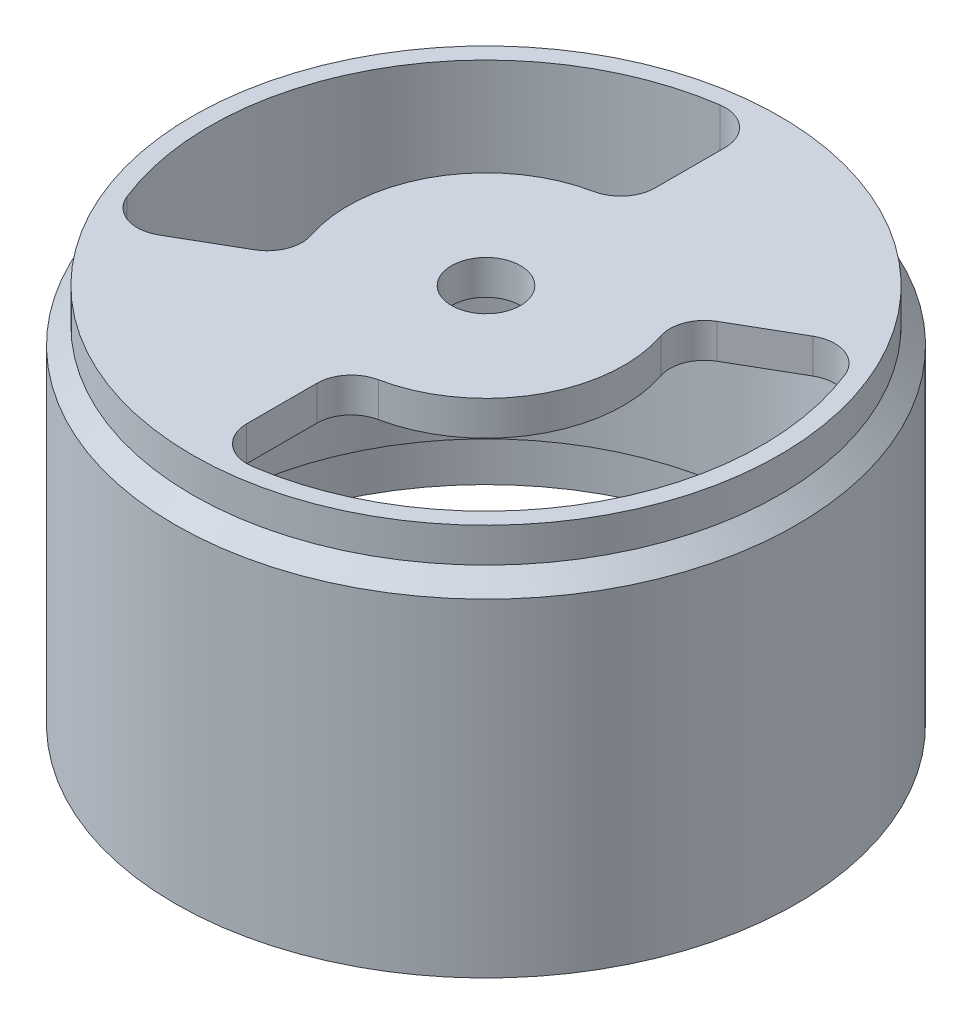
ISO-10303-21;
HEADER;
FILE_DESCRIPTION(('STEP AP214'),'2;1');
FILE_NAME('part.step','',(''),(''),'','','');
FILE_SCHEMA(('AUTOMOTIVE_DESIGN { 1 0 10303 214 1 1 1 1 }'));
ENDSEC;
DATA;
#1=APPLICATION_CONTEXT('core data for automotive mechanical design processes');
#2=APPLICATION_PROTOCOL_DEFINITION('international standard','automotive_design',2000,#1);
#3=PRODUCT_CONTEXT('',#1,'mechanical');
#4=PRODUCT('Part','Part','',(#3));
#5=PRODUCT_RELATED_PRODUCT_CATEGORY('part','',(#4));
#6=PRODUCT_DEFINITION_FORMATION('','',#4);
#7=PRODUCT_DEFINITION_CONTEXT('part definition',#1,'design');
#8=PRODUCT_DEFINITION('design','',#6,#7);
#9=PRODUCT_DEFINITION_SHAPE('','',#8);
#10=(LENGTH_UNIT() NAMED_UNIT(*) SI_UNIT(.MILLI.,.METRE.));
#11=(NAMED_UNIT(*) PLANE_ANGLE_UNIT() SI_UNIT($,.RADIAN.));
#12=(NAMED_UNIT(*) SI_UNIT($,.STERADIAN.) SOLID_ANGLE_UNIT());
#13=UNCERTAINTY_MEASURE_WITH_UNIT(LENGTH_MEASURE(1.E-05),#10,'distance_accuracy_value','');
#14=(GEOMETRIC_REPRESENTATION_CONTEXT(3) GLOBAL_UNCERTAINTY_ASSIGNED_CONTEXT((#13)) GLOBAL_UNIT_ASSIGNED_CONTEXT((#10,
#11,#12)) REPRESENTATION_CONTEXT('',''));
#15=CARTESIAN_POINT('',(0.,0.,0.));
#16=DIRECTION('',(0.,0.,1.));
#17=DIRECTION('',(1.,0.,0.));
#18=AXIS2_PLACEMENT_3D('',#15,#16,#17);
#19=CARTESIAN_POINT('',(0.,10.,0.));
#20=DIRECTION('',(0.,-1.,0.));
#21=DIRECTION('',(0.,0.,-1.));
#22=AXIS2_PLACEMENT_3D('',#19,#20,#21);
#23=CYLINDRICAL_SURFACE('',#22,8.);
#24=CARTESIAN_POINT('',(0.,9.08578643762691,0.));
#25=DIRECTION('',(0.,-1.,0.));
#26=DIRECTION('',(0.,0.,-1.));
#27=AXIS2_PLACEMENT_3D('',#24,#25,#26);
#28=CIRCLE('',#27,8.);
#29=CARTESIAN_POINT('',(1.14285714285714,9.08578643762691,7.9179465488863));
#30=VERTEX_POINT('',#29);
#31=CARTESIAN_POINT('',(-7.42857142857143,9.08578643762691,2.96922995583235));
#32=VERTEX_POINT('',#31);
#33=EDGE_CURVE('E266',#30,#32,#28,.T.);
#34=ORIENTED_EDGE('',*,*,#33,.F.);
#35=DIRECTION('',(0.,-1.,0.));
#36=VECTOR('',#35,1.);
#37=CARTESIAN_POINT('',(1.14285714285714,10.,7.9179465488863));
#38=LINE('',#37,#36);
#39=CARTESIAN_POINT('',(1.14285714285714,11.,7.9179465488863));
#40=VERTEX_POINT('',#39);
#41=EDGE_CURVE('E300',#30,#40,#38,.F.);
#42=ORIENTED_EDGE('',*,*,#41,.T.);
#43=CARTESIAN_POINT('',(0.,11.,0.));
#44=DIRECTION('',(0.,1.,0.));
#45=DIRECTION('',(0.,0.,1.));
#46=AXIS2_PLACEMENT_3D('',#43,#44,#45);
#47=CIRCLE('',#46,8.);
#48=CARTESIAN_POINT('',(7.42857142857144,11.,-2.96922995583235));
#49=VERTEX_POINT('',#48);
#50=EDGE_CURVE('E225',#40,#49,#47,.T.);
#51=ORIENTED_EDGE('',*,*,#50,.T.);
#52=DIRECTION('',(0.,-1.,0.));
#53=VECTOR('',#52,1.);
#54=CARTESIAN_POINT('',(7.42857142857144,10.,-2.96922995583235));
#55=LINE('',#54,#53);
#56=CARTESIAN_POINT('',(7.42857142857144,9.08578643762691,-2.96922995583235));
#57=VERTEX_POINT('',#56);
#58=EDGE_CURVE('E297',#49,#57,#55,.T.);
#59=ORIENTED_EDGE('',*,*,#58,.T.);
#60=CARTESIAN_POINT('',(-1.14285714285714,9.08578643762691,-7.9179465488863));
#61=VERTEX_POINT('',#60);
#62=EDGE_CURVE('E263',#61,#57,#28,.T.);
#63=ORIENTED_EDGE('',*,*,#62,.F.);
#64=DIRECTION('',(0.,-1.,0.));
#65=VECTOR('',#64,1.);
#66=CARTESIAN_POINT('',(-1.14285714285714,10.,-7.9179465488863));
#67=LINE('',#66,#65);
#68=CARTESIAN_POINT('',(-1.14285714285714,11.,-7.9179465488863));
#69=VERTEX_POINT('',#68);
#70=EDGE_CURVE('E294',#61,#69,#67,.F.);
#71=ORIENTED_EDGE('',*,*,#70,.T.);
#72=CARTESIAN_POINT('',(0.,11.,0.));
#73=DIRECTION('',(0.,1.,0.));
#74=DIRECTION('',(0.,0.,1.));
#75=AXIS2_PLACEMENT_3D('',#72,#73,#74);
#76=CIRCLE('',#75,8.);
#77=CARTESIAN_POINT('',(-7.42857142857143,11.,2.96922995583235));
#78=VERTEX_POINT('',#77);
#79=EDGE_CURVE('E247',#69,#78,#76,.T.);
#80=ORIENTED_EDGE('',*,*,#79,.T.);
#81=DIRECTION('',(0.,-1.,0.));
#82=VECTOR('',#81,1.);
#83=CARTESIAN_POINT('',(-7.42857142857143,10.,2.96922995583235));
#84=LINE('',#83,#82);
#85=EDGE_CURVE('E291',#78,#32,#84,.T.);
#86=ORIENTED_EDGE('',*,*,#85,.T.);
#87=EDGE_LOOP('',(#34,#42,#51,#59,#63,#71,#80,#86));
#88=FACE_BOUND('',#87,.T.);
#89=CARTESIAN_POINT('',(0.,1.5,0.));
#90=DIRECTION('',(0.,-1.,0.));
#91=DIRECTION('',(0.,0.,-1.));
#92=AXIS2_PLACEMENT_3D('',#89,#90,#91);
#93=CIRCLE('',#92,8.);
#94=CARTESIAN_POINT('',(0.,1.5,-8.));
#95=VERTEX_POINT('',#94);
#96=EDGE_CURVE('E63',#95,#95,#93,.T.);
#97=ORIENTED_EDGE('',*,*,#96,.T.);
#98=EDGE_LOOP('',(#97));
#99=FACE_BOUND('',#98,.T.);
#100=ADVANCED_FACE('F58',(#88,#99),#23,.F.);
#101=CARTESIAN_POINT('',(0.,11.,0.));
#102=DIRECTION('',(0.,-1.,0.));
#103=DIRECTION('',(0.,0.,-1.));
#104=AXIS2_PLACEMENT_3D('',#101,#102,#103);
#105=CYLINDRICAL_SURFACE('',#104,7.5);
#106=CARTESIAN_POINT('',(0.,10.,0.));
#107=DIRECTION('',(0.,1.,0.));
#108=DIRECTION('',(0.,0.,1.));
#109=AXIS2_PLACEMENT_3D('',#106,#107,#108);
#110=CIRCLE('',#109,7.5);
#111=CARTESIAN_POINT('',(-6.58242529266989,10.,3.59467345755073));
#112=VERTEX_POINT('',#111);
#113=CARTESIAN_POINT('',(0.17813411378636,10.,7.49788425074071));
#114=VERTEX_POINT('',#113);
#115=EDGE_CURVE('E75',#112,#114,#110,.T.);
#116=ORIENTED_EDGE('',*,*,#115,.T.);
#117=DIRECTION('',(0.,-1.,0.));
#118=VECTOR('',#117,1.);
#119=CARTESIAN_POINT('',(0.17813411378636,10.,7.49788425074071));
#120=LINE('',#119,#118);
#121=CARTESIAN_POINT('',(0.17813411378636,9.58578643762691,7.49788425074071));
#122=VERTEX_POINT('',#121);
#123=EDGE_CURVE('E326',#114,#122,#120,.T.);
#124=ORIENTED_EDGE('',*,*,#123,.T.);
#125=CARTESIAN_POINT('',(0.,9.58578643762691,0.));
#126=DIRECTION('',(0.,-1.,0.));
#127=DIRECTION('',(0.,0.,-1.));
#128=AXIS2_PLACEMENT_3D('',#125,#126,#127);
#129=CIRCLE('',#128,7.5);
#130=CARTESIAN_POINT('',(-6.58242529266989,9.58578643762691,3.59467345755073));
#131=VERTEX_POINT('',#130);
#132=EDGE_CURVE('E82',#131,#122,#129,.F.);
#133=ORIENTED_EDGE('',*,*,#132,.F.);
#134=DIRECTION('',(0.,-1.,0.));
#135=VECTOR('',#134,1.);
#136=CARTESIAN_POINT('',(-6.58242529266989,9.58578643762691,3.59467345755073));
#137=LINE('',#136,#135);
#138=EDGE_CURVE('E68',#131,#112,#137,.F.);
#139=ORIENTED_EDGE('',*,*,#138,.T.);
#140=EDGE_LOOP('',(#116,#124,#133,#139));
#141=FACE_BOUND('',#140,.T.);
#142=ADVANCED_FACE('F406',(#141),#105,.F.);
#143=CARTESIAN_POINT('',(0.,9.29289321881345,0.));
#144=DIRECTION('',(0.,-1.,0.));
#145=DIRECTION('',(0.,0.,-1.));
#146=AXIS2_PLACEMENT_3D('',#143,#144,#145);
#147=CONICAL_SURFACE('',#146,7.79289321881345,0.785398163397447);
#148=ORIENTED_EDGE('',*,*,#132,.T.);
#149=CARTESIAN_POINT('',(0.17813411378636,9.58578643762691,7.49788425074071));
#150=CARTESIAN_POINT('',(0.21500941892618,9.53167463315343,7.55110238689525));
#151=CARTESIAN_POINT('',(0.258315328258295,9.47906658067417,7.60247345378148));
#152=CARTESIAN_POINT('',(0.358292407830598,9.37930304443442,7.69831056983414));
#153=CARTESIAN_POINT('',(0.415092788726087,9.33220728921754,7.7427025023856));
#154=CARTESIAN_POINT('',(0.517640379004416,9.26335372047263,7.80537557824789));
#155=CARTESIAN_POINT('',(0.559331124867092,9.23878600374084,7.82715554800938));
#156=CARTESIAN_POINT('',(0.647288014509032,9.19415395910348,7.86515582549695));
#157=CARTESIAN_POINT('',(0.693540433250922,9.17407668226908,7.88139219233201));
#158=CARTESIAN_POINT('',(0.790421689839835,9.13922525535547,7.90729406501419));
#159=CARTESIAN_POINT('',(0.841094226456918,9.12451385579765,7.91688293175837));
#160=CARTESIAN_POINT('',(0.944766767733132,9.10182592961911,7.92802662619401));
#161=CARTESIAN_POINT('',(0.997760967111159,9.09383351214746,7.92960045488277));
#162=CARTESIAN_POINT('',(1.06612959912316,9.08828627294296,7.92613508081135));
#163=CARTESIAN_POINT('',(1.081522031319,9.0873491970376,7.924995161392));
#164=CARTESIAN_POINT('',(1.11224277636448,9.08610023103323,7.92200297090687));
#165=CARTESIAN_POINT('',(1.1275711465046,9.08578753110415,7.92015162629953));
#166=CARTESIAN_POINT('',(1.14285714285714,9.08578643762691,7.9179465488863));
#167=B_SPLINE_CURVE_WITH_KNOTS('',3,(#149,#150,#151,#152,#153,#154,#155,#156,#157,#158,#159,
#160,#161,#162,#163,#164,#165,#166),.UNSPECIFIED.,.F.,.F.,(4,2,2,2,2,2,2,2,4),(0.,
0.253992190062571,0.510522039116964,0.669134970104436,0.827284441823517,0.987228185803833,
1.14679257911584,1.19316106149131,1.2394693637052),.UNSPECIFIED.);
#168=EDGE_CURVE('E328',#122,#30,#167,.T.);
#169=ORIENTED_EDGE('',*,*,#168,.T.);
#170=ORIENTED_EDGE('',*,*,#33,.T.);
#171=CARTESIAN_POINT('',(-7.42857142857143,9.08578643762691,2.96922995583235));
#172=CARTESIAN_POINT('',(-7.41997643812216,9.08578449456347,2.99074027378264));
#173=CARTESIAN_POINT('',(-7.41063362550578,9.08649125966742,3.01193729427058));
#174=CARTESIAN_POINT('',(-7.390549591093,9.08929679160227,3.05354764314523));
#175=CARTESIAN_POINT('',(-7.37980920169478,9.09139473286979,3.07396142873001));
#176=CARTESIAN_POINT('',(-7.34579562838378,9.09969582044799,3.13352398066831));
#177=CARTESIAN_POINT('',(-7.32059518995107,9.10790712819858,3.17132832456306));
#178=CARTESIAN_POINT('',(-7.26619874207237,9.12916452821388,3.24223323305631));
#179=CARTESIAN_POINT('',(-7.2370104385996,9.14220137689784,3.27534262445724));
#180=CARTESIAN_POINT('',(-7.17565677572738,9.17243804267108,3.33656802448484));
#181=CARTESIAN_POINT('',(-7.14348714784484,9.1896438873675,3.364676700006));
#182=CARTESIAN_POINT('',(-7.06606942038945,9.23385335118195,3.42432517937462));
#183=CARTESIAN_POINT('',(-7.02005035462589,9.26220828138831,3.4538597600248));
#184=CARTESIAN_POINT('',(-6.92629490176341,9.32361505101384,3.50423213855524));
#185=CARTESIAN_POINT('',(-6.87855368098575,9.35668102765829,3.52504298848113));
#186=CARTESIAN_POINT('',(-6.78895116382085,9.42177334247466,3.55644200451828));
#187=CARTESIAN_POINT('',(-6.74712006907779,9.45339025253401,3.56799820245683));
#188=CARTESIAN_POINT('',(-6.66418020433353,9.51837478853844,3.58540543479931));
#189=CARTESIAN_POINT('',(-6.62306832611329,9.55172605730846,3.59130217134384));
#190=CARTESIAN_POINT('',(-6.58242529266989,9.58578643762691,3.59467345755073));
#191=B_SPLINE_CURVE_WITH_KNOTS('',3,(#171,#172,#173,#174,#175,#176,#177,#178,#179,#180,#181,
#182,#183,#184,#185,#186,#187,#188,#189,#190),.UNSPECIFIED.,.F.,.F.,(4,2,2,2,2,2,2,2,2,4),(0.,
0.0694413686588498,0.138841565673749,0.276576436997187,0.414048823835774,0.551721169258887,
0.73551513656647,0.919872740036792,1.08061398517146,1.24004598605782),.UNSPECIFIED.);
#192=EDGE_CURVE('E399',#32,#131,#191,.T.);
#193=ORIENTED_EDGE('',*,*,#192,.T.);
#194=EDGE_LOOP('',(#148,#169,#170,#193));
#195=FACE_BOUND('',#194,.T.);
#196=ADVANCED_FACE('F473',(#195),#147,.F.);
#197=CARTESIAN_POINT('',(0.,11.,0.));
#198=DIRECTION('',(0.,1.,0.));
#199=DIRECTION('',(0.,0.,1.));
#200=AXIS2_PLACEMENT_3D('',#197,#198,#199);
#201=PLANE('',#200);
#202=CARTESIAN_POINT('',(0.,11.,0.));
#203=DIRECTION('',(0.,1.,0.));
#204=DIRECTION('',(0.,0.,1.));
#205=AXIS2_PLACEMENT_3D('',#202,#203,#204);
#206=CIRCLE('',#205,1.);
#207=CARTESIAN_POINT('',(0.,11.,1.));
#208=VERTEX_POINT('',#207);
#209=EDGE_CURVE('E232',#208,#208,#206,.T.);
#210=ORIENTED_EDGE('',*,*,#209,.F.);
#211=EDGE_LOOP('',(#210));
#212=FACE_BOUND('',#211,.T.);
#213=DIRECTION('',(0.,0.,1.));
#214=VECTOR('',#213,1.);
#215=CARTESIAN_POINT('',(0.,11.,0.));
#216=LINE('',#215,#214);
#217=CARTESIAN_POINT('',(0.,11.,4.89897948556636));
#218=VERTEX_POINT('',#217);
#219=CARTESIAN_POINT('',(0.,11.,6.92820323027551));
#220=VERTEX_POINT('',#219);
#221=EDGE_CURVE('E214',#218,#220,#216,.T.);
#222=ORIENTED_EDGE('',*,*,#221,.F.);
#223=CARTESIAN_POINT('',(1.,11.,4.89897948556636));
#224=DIRECTION('',(0.,1.,0.));
#225=DIRECTION('',(0.,0.,1.));
#226=AXIS2_PLACEMENT_3D('',#223,#224,#225);
#227=CIRCLE('',#226,1.);
#228=CARTESIAN_POINT('',(0.8,11.,3.91918358845308));
#229=VERTEX_POINT('',#228);
#230=EDGE_CURVE('E197',#218,#229,#227,.F.);
#231=ORIENTED_EDGE('',*,*,#230,.T.);
#232=CARTESIAN_POINT('',(0.,11.,0.));
#233=DIRECTION('',(0.,1.,0.));
#234=DIRECTION('',(0.,0.,1.));
#235=AXIS2_PLACEMENT_3D('',#232,#233,#234);
#236=CIRCLE('',#235,4.);
#237=CARTESIAN_POINT('',(3.79411254969543,11.,-1.26677147119898));
#238=VERTEX_POINT('',#237);
#239=EDGE_CURVE('E238',#229,#238,#236,.T.);
#240=ORIENTED_EDGE('',*,*,#239,.T.);
#241=CARTESIAN_POINT('',(4.74264068711929,11.,-1.58346433899873));
#242=DIRECTION('',(0.,1.,0.));
#243=DIRECTION('',(0.,0.,1.));
#244=AXIS2_PLACEMENT_3D('',#241,#242,#243);
#245=CIRCLE('',#244,1.);
#246=CARTESIAN_POINT('',(4.24264068711929,11.,-2.44948974278317));
#247=VERTEX_POINT('',#246);
#248=EDGE_CURVE('E336',#238,#247,#245,.F.);
#249=ORIENTED_EDGE('',*,*,#248,.T.);
#250=DIRECTION('',(-0.86602540378444,0.,0.499999999999998));
#251=VECTOR('',#250,1.);
#252=CARTESIAN_POINT('',(0.,11.,0.));
#253=LINE('',#252,#251);
#254=CARTESIAN_POINT('',(6.00000000000001,11.,-3.46410161513774));
#255=VERTEX_POINT('',#254);
#256=EDGE_CURVE('E229',#255,#247,#253,.T.);
#257=ORIENTED_EDGE('',*,*,#256,.F.);
#258=CARTESIAN_POINT('',(6.50000000000001,11.,-2.5980762113533));
#259=DIRECTION('',(0.,1.,0.));
#260=DIRECTION('',(0.,0.,1.));
#261=AXIS2_PLACEMENT_3D('',#258,#259,#260);
#262=CIRCLE('',#261,1.);
#263=EDGE_CURVE('E370',#255,#49,#262,.F.);
#264=ORIENTED_EDGE('',*,*,#263,.T.);
#265=ORIENTED_EDGE('',*,*,#50,.F.);
#266=CARTESIAN_POINT('',(1.,11.,6.92820323027551));
#267=DIRECTION('',(0.,1.,0.));
#268=DIRECTION('',(0.,0.,1.));
#269=AXIS2_PLACEMENT_3D('',#266,#267,#268);
#270=CIRCLE('',#269,1.);
#271=EDGE_CURVE('E224',#40,#220,#270,.F.);
#272=ORIENTED_EDGE('',*,*,#271,.T.);
#273=EDGE_LOOP('',(#222,#231,#240,#249,#257,#264,#265,#272));
#274=FACE_BOUND('',#273,.T.);
#275=CARTESIAN_POINT('',(0.,11.,0.));
#276=DIRECTION('',(0.,1.,0.));
#277=DIRECTION('',(0.,0.,1.));
#278=AXIS2_PLACEMENT_3D('',#275,#276,#277);
#279=CIRCLE('',#278,8.5);
#280=CARTESIAN_POINT('',(0.,11.,8.5));
#281=VERTEX_POINT('',#280);
#282=EDGE_CURVE('E270',#281,#281,#279,.T.);
#283=ORIENTED_EDGE('',*,*,#282,.T.);
#284=EDGE_LOOP('',(#283));
#285=FACE_BOUND('',#284,.T.);
#286=ORIENTED_EDGE('',*,*,#79,.F.);
#287=CARTESIAN_POINT('',(-1.,11.,-6.92820323027551));
#288=DIRECTION('',(0.,1.,0.));
#289=DIRECTION('',(0.,0.,1.));
#290=AXIS2_PLACEMENT_3D('',#287,#288,#289);
#291=CIRCLE('',#290,1.);
#292=CARTESIAN_POINT('',(0.,11.,-6.92820323027551));
#293=VERTEX_POINT('',#292);
#294=EDGE_CURVE('E375',#69,#293,#291,.F.);
#295=ORIENTED_EDGE('',*,*,#294,.T.);
#296=DIRECTION('',(0.,0.,1.));
#297=VECTOR('',#296,1.);
#298=CARTESIAN_POINT('',(0.,11.,0.));
#299=LINE('',#298,#297);
#300=CARTESIAN_POINT('',(0.,11.,-4.89897948556636));
#301=VERTEX_POINT('',#300);
#302=EDGE_CURVE('E244',#293,#301,#299,.T.);
#303=ORIENTED_EDGE('',*,*,#302,.T.);
#304=CARTESIAN_POINT('',(-1.,11.,-4.89897948556636));
#305=DIRECTION('',(0.,1.,0.));
#306=DIRECTION('',(0.,0.,1.));
#307=AXIS2_PLACEMENT_3D('',#304,#305,#306);
#308=CIRCLE('',#307,1.);
#309=CARTESIAN_POINT('',(-0.8,11.,-3.91918358845308));
#310=VERTEX_POINT('',#309);
#311=EDGE_CURVE('E389',#301,#310,#308,.F.);
#312=ORIENTED_EDGE('',*,*,#311,.T.);
#313=CARTESIAN_POINT('',(0.,11.,0.));
#314=DIRECTION('',(0.,1.,0.));
#315=DIRECTION('',(0.,0.,1.));
#316=AXIS2_PLACEMENT_3D('',#313,#314,#315);
#317=CIRCLE('',#316,4.);
#318=CARTESIAN_POINT('',(-3.79411254969543,11.,1.26677147119899));
#319=VERTEX_POINT('',#318);
#320=EDGE_CURVE('E253',#310,#319,#317,.T.);
#321=ORIENTED_EDGE('',*,*,#320,.T.);
#322=CARTESIAN_POINT('',(-4.74264068711929,11.,1.58346433899873));
#323=DIRECTION('',(0.,1.,0.));
#324=DIRECTION('',(0.,0.,1.));
#325=AXIS2_PLACEMENT_3D('',#322,#323,#324);
#326=CIRCLE('',#325,1.);
#327=CARTESIAN_POINT('',(-4.24264068711929,11.,2.44948974278317));
#328=VERTEX_POINT('',#327);
#329=EDGE_CURVE('E393',#319,#328,#326,.F.);
#330=ORIENTED_EDGE('',*,*,#329,.T.);
#331=DIRECTION('',(-0.86602540378444,0.,0.499999999999998));
#332=VECTOR('',#331,1.);
#333=CARTESIAN_POINT('',(0.,11.,0.));
#334=LINE('',#333,#332);
#335=CARTESIAN_POINT('',(-6.00000000000001,11.,3.46410161513774));
#336=VERTEX_POINT('',#335);
#337=EDGE_CURVE('E250',#328,#336,#334,.T.);
#338=ORIENTED_EDGE('',*,*,#337,.T.);
#339=CARTESIAN_POINT('',(-6.50000000000001,11.,2.5980762113533));
#340=DIRECTION('',(0.,1.,0.));
#341=DIRECTION('',(0.,0.,1.));
#342=AXIS2_PLACEMENT_3D('',#339,#340,#341);
#343=CIRCLE('',#342,1.);
#344=EDGE_CURVE('E397',#336,#78,#343,.F.);
#345=ORIENTED_EDGE('',*,*,#344,.T.);
#346=EDGE_LOOP('',(#286,#295,#303,#312,#321,#330,#338,#345));
#347=FACE_BOUND('',#346,.T.);
#348=ADVANCED_FACE('F221',(#212,#274,#285,#347),#201,.T.);
#349=CARTESIAN_POINT('',(6.58242529266989,9.58578643762691,-3.59467345755072));
#350=VERTEX_POINT('',#349);
#351=CARTESIAN_POINT('',(-0.17813411378636,9.58578643762691,-7.49788425074071));
#352=VERTEX_POINT('',#351);
#353=EDGE_CURVE('E262',#350,#352,#129,.F.);
#354=ORIENTED_EDGE('',*,*,#353,.F.);
#355=DIRECTION('',(0.,-1.,0.));
#356=VECTOR('',#355,1.);
#357=CARTESIAN_POINT('',(6.58242529266989,9.58578643762691,-3.59467345755072));
#358=LINE('',#357,#356);
#359=CARTESIAN_POINT('',(6.58242529266989,10.,-3.59467345755072));
#360=VERTEX_POINT('',#359);
#361=EDGE_CURVE('E369',#350,#360,#358,.F.);
#362=ORIENTED_EDGE('',*,*,#361,.T.);
#363=CARTESIAN_POINT('',(-0.17813411378636,10.,-7.49788425074071));
#364=VERTEX_POINT('',#363);
#365=EDGE_CURVE('E268',#360,#364,#110,.T.);
#366=ORIENTED_EDGE('',*,*,#365,.T.);
#367=DIRECTION('',(0.,-1.,0.));
#368=VECTOR('',#367,1.);
#369=CARTESIAN_POINT('',(-0.17813411378636,10.,-7.49788425074071));
#370=LINE('',#369,#368);
#371=EDGE_CURVE('E380',#364,#352,#370,.T.);
#372=ORIENTED_EDGE('',*,*,#371,.T.);
#373=EDGE_LOOP('',(#354,#362,#366,#372));
#374=FACE_BOUND('',#373,.T.);
#375=ADVANCED_FACE('F444',(#374),#105,.F.);
#376=CARTESIAN_POINT('',(0.,10.,0.));
#377=DIRECTION('',(0.,1.,0.));
#378=DIRECTION('',(0.,0.,1.));
#379=AXIS2_PLACEMENT_3D('',#376,#377,#378);
#380=PLANE('',#379);
#381=CARTESIAN_POINT('',(0.,10.,0.));
#382=DIRECTION('',(0.,1.,0.));
#383=DIRECTION('',(0.,0.,1.));
#384=AXIS2_PLACEMENT_3D('',#381,#382,#383);
#385=CIRCLE('',#384,1.);
#386=CARTESIAN_POINT('',(0.,10.,1.));
#387=VERTEX_POINT('',#386);
#388=EDGE_CURVE('E226',#387,#387,#385,.T.);
#389=ORIENTED_EDGE('',*,*,#388,.T.);
#390=EDGE_LOOP('',(#389));
#391=FACE_BOUND('',#390,.T.);
#392=CARTESIAN_POINT('',(0.,10.,0.));
#393=DIRECTION('',(0.,1.,0.));
#394=DIRECTION('',(0.,0.,1.));
#395=AXIS2_PLACEMENT_3D('',#392,#393,#394);
#396=CIRCLE('',#395,4.);
#397=CARTESIAN_POINT('',(0.8,10.,3.91918358845308));
#398=VERTEX_POINT('',#397);
#399=CARTESIAN_POINT('',(3.79411254969543,10.,-1.26677147119898));
#400=VERTEX_POINT('',#399);
#401=EDGE_CURVE('E284',#398,#400,#396,.T.);
#402=ORIENTED_EDGE('',*,*,#401,.F.);
#403=CARTESIAN_POINT('',(1.,10.,4.89897948556636));
#404=DIRECTION('',(0.,1.,0.));
#405=DIRECTION('',(0.,0.,1.));
#406=AXIS2_PLACEMENT_3D('',#403,#404,#405);
#407=CIRCLE('',#406,1.);
#408=CARTESIAN_POINT('',(0.,10.,4.89897948556636));
#409=VERTEX_POINT('',#408);
#410=EDGE_CURVE('E207',#398,#409,#407,.T.);
#411=ORIENTED_EDGE('',*,*,#410,.T.);
#412=DIRECTION('',(0.,0.,1.));
#413=VECTOR('',#412,1.);
#414=CARTESIAN_POINT('',(0.,10.,0.));
#415=LINE('',#414,#413);
#416=CARTESIAN_POINT('',(0.,10.,6.92820323027551));
#417=VERTEX_POINT('',#416);
#418=EDGE_CURVE('E217',#409,#417,#415,.T.);
#419=ORIENTED_EDGE('',*,*,#418,.T.);
#420=CARTESIAN_POINT('',(1.,10.,6.92820323027551));
#421=DIRECTION('',(0.,1.,0.));
#422=DIRECTION('',(0.,0.,1.));
#423=AXIS2_PLACEMENT_3D('',#420,#421,#422);
#424=CIRCLE('',#423,1.);
#425=EDGE_CURVE('E324',#417,#114,#424,.T.);
#426=ORIENTED_EDGE('',*,*,#425,.T.);
#427=ORIENTED_EDGE('',*,*,#115,.F.);
#428=CARTESIAN_POINT('',(-6.50000000000001,10.,2.5980762113533));
#429=DIRECTION('',(0.,1.,0.));
#430=DIRECTION('',(0.,0.,1.));
#431=AXIS2_PLACEMENT_3D('',#428,#429,#430);
#432=CIRCLE('',#431,1.);
#433=CARTESIAN_POINT('',(-6.00000000000001,10.,3.46410161513775));
#434=VERTEX_POINT('',#433);
#435=EDGE_CURVE('E12',#112,#434,#432,.T.);
#436=ORIENTED_EDGE('',*,*,#435,.T.);
#437=DIRECTION('',(-0.86602540378444,0.,0.499999999999998));
#438=VECTOR('',#437,1.);
#439=CARTESIAN_POINT('',(0.,10.,0.));
#440=LINE('',#439,#438);
#441=CARTESIAN_POINT('',(-4.24264068711929,10.,2.44948974278317));
#442=VERTEX_POINT('',#441);
#443=EDGE_CURVE('E256',#442,#434,#440,.T.);
#444=ORIENTED_EDGE('',*,*,#443,.F.);
#445=CARTESIAN_POINT('',(-4.74264068711929,10.,1.58346433899873));
#446=DIRECTION('',(0.,1.,0.));
#447=DIRECTION('',(0.,0.,1.));
#448=AXIS2_PLACEMENT_3D('',#445,#446,#447);
#449=CIRCLE('',#448,1.);
#450=CARTESIAN_POINT('',(-3.79411254969543,10.,1.26677147119899));
#451=VERTEX_POINT('',#450);
#452=EDGE_CURVE('E395',#442,#451,#449,.T.);
#453=ORIENTED_EDGE('',*,*,#452,.T.);
#454=CARTESIAN_POINT('',(0.,10.,0.));
#455=DIRECTION('',(0.,1.,0.));
#456=DIRECTION('',(0.,0.,1.));
#457=AXIS2_PLACEMENT_3D('',#454,#455,#456);
#458=CIRCLE('',#457,4.);
#459=CARTESIAN_POINT('',(-0.8,10.,-3.91918358845308));
#460=VERTEX_POINT('',#459);
#461=EDGE_CURVE('E281',#460,#451,#458,.T.);
#462=ORIENTED_EDGE('',*,*,#461,.F.);
#463=CARTESIAN_POINT('',(-1.,10.,-4.89897948556636));
#464=DIRECTION('',(0.,1.,0.));
#465=DIRECTION('',(0.,0.,1.));
#466=AXIS2_PLACEMENT_3D('',#463,#464,#465);
#467=CIRCLE('',#466,1.);
#468=CARTESIAN_POINT('',(0.,10.,-4.89897948556636));
#469=VERTEX_POINT('',#468);
#470=EDGE_CURVE('E391',#460,#469,#467,.T.);
#471=ORIENTED_EDGE('',*,*,#470,.T.);
#472=DIRECTION('',(0.,0.,1.));
#473=VECTOR('',#472,1.);
#474=CARTESIAN_POINT('',(0.,10.,0.));
#475=LINE('',#474,#473);
#476=CARTESIAN_POINT('',(0.,10.,-6.92820323027551));
#477=VERTEX_POINT('',#476);
#478=EDGE_CURVE('E259',#477,#469,#475,.T.);
#479=ORIENTED_EDGE('',*,*,#478,.F.);
#480=CARTESIAN_POINT('',(-1.,10.,-6.92820323027551));
#481=DIRECTION('',(0.,1.,0.));
#482=DIRECTION('',(0.,0.,1.));
#483=AXIS2_PLACEMENT_3D('',#480,#481,#482);
#484=CIRCLE('',#483,1.);
#485=EDGE_CURVE('E377',#477,#364,#484,.T.);
#486=ORIENTED_EDGE('',*,*,#485,.T.);
#487=ORIENTED_EDGE('',*,*,#365,.F.);
#488=CARTESIAN_POINT('',(6.50000000000001,10.,-2.5980762113533));
#489=DIRECTION('',(0.,1.,0.));
#490=DIRECTION('',(0.,0.,1.));
#491=AXIS2_PLACEMENT_3D('',#488,#489,#490);
#492=CIRCLE('',#491,1.);
#493=CARTESIAN_POINT('',(6.00000000000001,10.,-3.46410161513774));
#494=VERTEX_POINT('',#493);
#495=EDGE_CURVE('E373',#360,#494,#492,.T.);
#496=ORIENTED_EDGE('',*,*,#495,.T.);
#497=DIRECTION('',(-0.86602540378444,0.,0.499999999999998));
#498=VECTOR('',#497,1.);
#499=CARTESIAN_POINT('',(0.,10.,0.));
#500=LINE('',#499,#498);
#501=CARTESIAN_POINT('',(4.24264068711929,10.,-2.44948974278317));
#502=VERTEX_POINT('',#501);
#503=EDGE_CURVE('E240',#494,#502,#500,.T.);
#504=ORIENTED_EDGE('',*,*,#503,.T.);
#505=CARTESIAN_POINT('',(4.74264068711929,10.,-1.58346433899873));
#506=DIRECTION('',(0.,1.,0.));
#507=DIRECTION('',(0.,0.,1.));
#508=AXIS2_PLACEMENT_3D('',#505,#506,#507);
#509=CIRCLE('',#508,1.);
#510=EDGE_CURVE('E453',#502,#400,#509,.T.);
#511=ORIENTED_EDGE('',*,*,#510,.T.);
#512=EDGE_LOOP('',(#402,#411,#419,#426,#427,#436,#444,#453,#462,#471,#479,#486,#487,#496,#504,#511));
#513=FACE_BOUND('',#512,.T.);
#514=ADVANCED_FACE('F412',(#391,#513),#380,.F.);
#515=ORIENTED_EDGE('',*,*,#62,.T.);
#516=CARTESIAN_POINT('',(7.42857142857144,9.08578643762691,-2.96922995583235));
#517=CARTESIAN_POINT('',(7.41997643812216,9.08578449456347,-2.99074027378264));
#518=CARTESIAN_POINT('',(7.41063362550578,9.08649125966742,-3.01193729427058));
#519=CARTESIAN_POINT('',(7.390549591093,9.08929679160227,-3.05354764314523));
#520=CARTESIAN_POINT('',(7.37980920169478,9.09139473286979,-3.07396142873001));
#521=CARTESIAN_POINT('',(7.34579562838378,9.09969582044799,-3.13352398066831));
#522=CARTESIAN_POINT('',(7.32059518995107,9.10790712819858,-3.17132832456306));
#523=CARTESIAN_POINT('',(7.26619874207238,9.12916452821388,-3.24223323305631));
#524=CARTESIAN_POINT('',(7.2370104385996,9.14220137689784,-3.27534262445723));
#525=CARTESIAN_POINT('',(7.17565677572738,9.17243804267108,-3.33656802448484));
#526=CARTESIAN_POINT('',(7.14348714784485,9.1896438873675,-3.364676700006));
#527=CARTESIAN_POINT('',(7.06606942038945,9.23385335118195,-3.42432517937462));
#528=CARTESIAN_POINT('',(7.02005035462589,9.26220828138831,-3.45385976002479));
#529=CARTESIAN_POINT('',(6.92629490176341,9.32361505101384,-3.50423213855524));
#530=CARTESIAN_POINT('',(6.87855368098575,9.35668102765829,-3.52504298848113));
#531=CARTESIAN_POINT('',(6.78895116382086,9.42177334247466,-3.55644200451828));
#532=CARTESIAN_POINT('',(6.74712006907779,9.45339025253401,-3.56799820245682));
#533=CARTESIAN_POINT('',(6.66418020433353,9.51837478853844,-3.58540543479931));
#534=CARTESIAN_POINT('',(6.62306832611329,9.55172605730846,-3.59130217134384));
#535=CARTESIAN_POINT('',(6.58242529266989,9.58578643762691,-3.59467345755072));
#536=B_SPLINE_CURVE_WITH_KNOTS('',3,(#516,#517,#518,#519,#520,#521,#522,#523,#524,#525,#526,
#527,#528,#529,#530,#531,#532,#533,#534,#535),.UNSPECIFIED.,.F.,.F.,(4,2,2,2,2,2,2,2,2,4),(0.,
0.0694413686588498,0.138841565673749,0.276576436997187,0.414048823835773,0.551721169258887,
0.735515136566473,0.919872740036792,1.08061398517146,1.24004598605782),.UNSPECIFIED.);
#537=EDGE_CURVE('E362',#57,#350,#536,.T.);
#538=ORIENTED_EDGE('',*,*,#537,.T.);
#539=ORIENTED_EDGE('',*,*,#353,.T.);
#540=CARTESIAN_POINT('',(-0.17813411378636,9.58578643762691,-7.49788425074071));
#541=CARTESIAN_POINT('',(-0.21500941892618,9.53167463315343,-7.55110238689525));
#542=CARTESIAN_POINT('',(-0.258315328258295,9.47906658067417,-7.60247345378148));
#543=CARTESIAN_POINT('',(-0.358292407830598,9.37930304443442,-7.69831056983414));
#544=CARTESIAN_POINT('',(-0.415092788726087,9.33220728921754,-7.7427025023856));
#545=CARTESIAN_POINT('',(-0.517640379004416,9.26335372047263,-7.80537557824789));
#546=CARTESIAN_POINT('',(-0.559331124867092,9.23878600374084,-7.82715554800938));
#547=CARTESIAN_POINT('',(-0.647288014509032,9.19415395910348,-7.86515582549695));
#548=CARTESIAN_POINT('',(-0.693540433250922,9.17407668226908,-7.88139219233201));
#549=CARTESIAN_POINT('',(-0.790421689839835,9.13922525535547,-7.90729406501419));
#550=CARTESIAN_POINT('',(-0.841094226456918,9.12451385579765,-7.91688293175837));
#551=CARTESIAN_POINT('',(-0.944766767733132,9.10182592961911,-7.92802662619401));
#552=CARTESIAN_POINT('',(-0.997760967111159,9.09383351214746,-7.92960045488277));
#553=CARTESIAN_POINT('',(-1.06612959912316,9.08828627294296,-7.92613508081135));
#554=CARTESIAN_POINT('',(-1.081522031319,9.0873491970376,-7.924995161392));
#555=CARTESIAN_POINT('',(-1.11224277636448,9.08610023103323,-7.92200297090687));
#556=CARTESIAN_POINT('',(-1.1275711465046,9.08578753110415,-7.92015162629953));
#557=CARTESIAN_POINT('',(-1.14285714285714,9.08578643762691,-7.9179465488863));
#558=B_SPLINE_CURVE_WITH_KNOTS('',3,(#540,#541,#542,#543,#544,#545,#546,#547,#548,#549,#550,
#551,#552,#553,#554,#555,#556,#557),.UNSPECIFIED.,.F.,.F.,(4,2,2,2,2,2,2,2,4),(0.,
0.253992190062571,0.510522039116964,0.669134970104436,0.827284441823517,0.987228185803833,
1.14679257911584,1.19316106149131,1.2394693637052),.UNSPECIFIED.);
#559=EDGE_CURVE('E383',#352,#61,#558,.T.);
#560=ORIENTED_EDGE('',*,*,#559,.T.);
#561=EDGE_LOOP('',(#515,#538,#539,#560));
#562=FACE_BOUND('',#561,.T.);
#563=ADVANCED_FACE('F338',(#562),#147,.F.);
#564=CARTESIAN_POINT('',(0.,10.,0.));
#565=DIRECTION('',(0.,-1.,0.));
#566=DIRECTION('',(0.,0.,-1.));
#567=AXIS2_PLACEMENT_3D('',#564,#565,#566);
#568=CYLINDRICAL_SURFACE('',#567,9.);
#569=CARTESIAN_POINT('',(0.,9.5,0.));
#570=DIRECTION('',(0.,1.,0.));
#571=DIRECTION('',(0.,0.,1.));
#572=AXIS2_PLACEMENT_3D('',#569,#570,#571);
#573=CIRCLE('',#572,9.);
#574=CARTESIAN_POINT('',(0.,9.5,9.));
#575=VERTEX_POINT('',#574);
#576=EDGE_CURVE('E278',#575,#575,#573,.F.);
#577=ORIENTED_EDGE('',*,*,#576,.T.);
#578=EDGE_LOOP('',(#577));
#579=FACE_BOUND('',#578,.T.);
#580=CARTESIAN_POINT('',(0.,0.,0.));
#581=DIRECTION('',(0.,1.,0.));
#582=DIRECTION('',(0.,0.,1.));
#583=AXIS2_PLACEMENT_3D('',#580,#581,#582);
#584=CIRCLE('',#583,9.);
#585=CARTESIAN_POINT('',(0.,0.,9.));
#586=VERTEX_POINT('',#585);
#587=EDGE_CURVE('E273',#586,#586,#584,.T.);
#588=ORIENTED_EDGE('',*,*,#587,.T.);
#589=EDGE_LOOP('',(#588));
#590=FACE_BOUND('',#589,.T.);
#591=ADVANCED_FACE('F483',(#579,#590),#568,.T.);
#592=CARTESIAN_POINT('',(0.,0.,0.));
#593=DIRECTION('',(0.,1.,0.));
#594=DIRECTION('',(0.,0.,1.));
#595=AXIS2_PLACEMENT_3D('',#592,#593,#594);
#596=PLANE('',#595);
#597=CARTESIAN_POINT('',(0.,0.,0.));
#598=DIRECTION('',(0.,-1.,0.));
#599=DIRECTION('',(0.,0.,-1.));
#600=AXIS2_PLACEMENT_3D('',#597,#598,#599);
#601=CIRCLE('',#600,8.5);
#602=CARTESIAN_POINT('',(0.,0.,-8.5));
#603=VERTEX_POINT('',#602);
#604=EDGE_CURVE('E510',#603,#603,#601,.T.);
#605=ORIENTED_EDGE('',*,*,#604,.F.);
#606=EDGE_LOOP('',(#605));
#607=FACE_BOUND('',#606,.T.);
#608=ORIENTED_EDGE('',*,*,#587,.F.);
#609=EDGE_LOOP('',(#608));
#610=FACE_BOUND('',#609,.T.);
#611=ADVANCED_FACE('F516',(#607,#610),#596,.F.);
#612=CARTESIAN_POINT('',(0.,11.,0.));
#613=DIRECTION('',(0.,-1.,0.));
#614=DIRECTION('',(0.,0.,-1.));
#615=AXIS2_PLACEMENT_3D('',#612,#613,#614);
#616=CYLINDRICAL_SURFACE('',#615,8.5);
#617=ORIENTED_EDGE('',*,*,#282,.F.);
#618=EDGE_LOOP('',(#617));
#619=FACE_BOUND('',#618,.T.);
#620=CARTESIAN_POINT('',(0.,10.,0.));
#621=DIRECTION('',(0.,1.,0.));
#622=DIRECTION('',(0.,0.,1.));
#623=AXIS2_PLACEMENT_3D('',#620,#621,#622);
#624=CIRCLE('',#623,8.5);
#625=CARTESIAN_POINT('',(0.,10.,8.5));
#626=VERTEX_POINT('',#625);
#627=EDGE_CURVE('E265',#626,#626,#624,.T.);
#628=ORIENTED_EDGE('',*,*,#627,.T.);
#629=EDGE_LOOP('',(#628));
#630=FACE_BOUND('',#629,.T.);
#631=ADVANCED_FACE('F519',(#619,#630),#616,.T.);
#632=CARTESIAN_POINT('',(0.,10.,0.));
#633=DIRECTION('',(0.,-1.,0.));
#634=DIRECTION('',(0.,0.,-1.));
#635=AXIS2_PLACEMENT_3D('',#632,#633,#634);
#636=CONICAL_SURFACE('',#635,8.5,0.785398163397447);
#637=ORIENTED_EDGE('',*,*,#576,.F.);
#638=EDGE_LOOP('',(#637));
#639=FACE_BOUND('',#638,.T.);
#640=ORIENTED_EDGE('',*,*,#627,.F.);
#641=EDGE_LOOP('',(#640));
#642=FACE_BOUND('',#641,.T.);
#643=ADVANCED_FACE('F529',(#639,#642),#636,.T.);
#644=CARTESIAN_POINT('',(0.,0.,0.));
#645=DIRECTION('',(0.,1.,0.));
#646=DIRECTION('',(0.,0.,1.));
#647=AXIS2_PLACEMENT_3D('',#644,#645,#646);
#648=CYLINDRICAL_SURFACE('',#647,4.);
#649=ORIENTED_EDGE('',*,*,#320,.F.);
#650=DIRECTION('',(0.,1.,0.));
#651=VECTOR('',#650,1.);
#652=CARTESIAN_POINT('',(-0.8,0.,-3.91918358845309));
#653=LINE('',#652,#651);
#654=EDGE_CURVE('E316',#310,#460,#653,.F.);
#655=ORIENTED_EDGE('',*,*,#654,.T.);
#656=ORIENTED_EDGE('',*,*,#461,.T.);
#657=DIRECTION('',(0.,1.,0.));
#658=VECTOR('',#657,1.);
#659=CARTESIAN_POINT('',(-3.79411254969543,0.,1.26677147119899));
#660=LINE('',#659,#658);
#661=EDGE_CURVE('E313',#451,#319,#660,.T.);
#662=ORIENTED_EDGE('',*,*,#661,.T.);
#663=EDGE_LOOP('',(#649,#655,#656,#662));
#664=FACE_BOUND('',#663,.T.);
#665=ADVANCED_FACE('F425',(#664),#648,.T.);
#666=CARTESIAN_POINT('',(0.,0.,0.));
#667=DIRECTION('',(-1.,0.,0.));
#668=DIRECTION('',(0.,0.,1.));
#669=AXIS2_PLACEMENT_3D('',#666,#667,#668);
#670=PLANE('',#669);
#671=ORIENTED_EDGE('',*,*,#302,.F.);
#672=DIRECTION('',(0.,1.,0.));
#673=VECTOR('',#672,1.);
#674=CARTESIAN_POINT('',(0.,9.08578643762691,-6.92820323027551));
#675=LINE('',#674,#673);
#676=EDGE_CURVE('E311',#293,#477,#675,.F.);
#677=ORIENTED_EDGE('',*,*,#676,.T.);
#678=ORIENTED_EDGE('',*,*,#478,.T.);
#679=DIRECTION('',(0.,-1.,0.));
#680=VECTOR('',#679,1.);
#681=CARTESIAN_POINT('',(0.,11.,-4.89897948556636));
#682=LINE('',#681,#680);
#683=EDGE_CURVE('E308',#469,#301,#682,.F.);
#684=ORIENTED_EDGE('',*,*,#683,.T.);
#685=EDGE_LOOP('',(#671,#677,#678,#684));
#686=FACE_BOUND('',#685,.T.);
#687=ADVANCED_FACE('F434',(#686),#670,.T.);
#688=CARTESIAN_POINT('',(0.,0.,0.));
#689=DIRECTION('',(-0.499999999999998,0.,-0.86602540378444));
#690=DIRECTION('',(-0.86602540378444,0.,0.499999999999998));
#691=AXIS2_PLACEMENT_3D('',#688,#689,#690);
#692=PLANE('',#691);
#693=ORIENTED_EDGE('',*,*,#337,.F.);
#694=DIRECTION('',(0.,-1.,0.));
#695=VECTOR('',#694,1.);
#696=CARTESIAN_POINT('',(-4.24264068711929,10.,2.44948974278317));
#697=LINE('',#696,#695);
#698=EDGE_CURVE('E208',#328,#442,#697,.T.);
#699=ORIENTED_EDGE('',*,*,#698,.T.);
#700=ORIENTED_EDGE('',*,*,#443,.T.);
#701=DIRECTION('',(0.,1.,0.));
#702=VECTOR('',#701,1.);
#703=CARTESIAN_POINT('',(-6.00000000000001,11.,3.46410161513774));
#704=LINE('',#703,#702);
#705=EDGE_CURVE('E318',#434,#336,#704,.T.);
#706=ORIENTED_EDGE('',*,*,#705,.T.);
#707=EDGE_LOOP('',(#693,#699,#700,#706));
#708=FACE_BOUND('',#707,.T.);
#709=ADVANCED_FACE('F416',(#708),#692,.T.);
#710=CARTESIAN_POINT('',(0.,0.,0.));
#711=DIRECTION('',(0.,1.,0.));
#712=DIRECTION('',(0.,0.,1.));
#713=AXIS2_PLACEMENT_3D('',#710,#711,#712);
#714=CYLINDRICAL_SURFACE('',#713,4.);
#715=ORIENTED_EDGE('',*,*,#239,.F.);
#716=DIRECTION('',(0.,1.,0.));
#717=VECTOR('',#716,1.);
#718=CARTESIAN_POINT('',(0.8,0.,3.91918358845309));
#719=LINE('',#718,#717);
#720=EDGE_CURVE('E202',#229,#398,#719,.F.);
#721=ORIENTED_EDGE('',*,*,#720,.T.);
#722=ORIENTED_EDGE('',*,*,#401,.T.);
#723=DIRECTION('',(0.,1.,0.));
#724=VECTOR('',#723,1.);
#725=CARTESIAN_POINT('',(3.79411254969543,0.,-1.26677147119898));
#726=LINE('',#725,#724);
#727=EDGE_CURVE('E218',#400,#238,#726,.T.);
#728=ORIENTED_EDGE('',*,*,#727,.T.);
#729=EDGE_LOOP('',(#715,#721,#722,#728));
#730=FACE_BOUND('',#729,.T.);
#731=ADVANCED_FACE('F456',(#730),#714,.T.);
#732=CARTESIAN_POINT('',(0.,0.,0.));
#733=DIRECTION('',(-1.,0.,0.));
#734=DIRECTION('',(0.,0.,1.));
#735=AXIS2_PLACEMENT_3D('',#732,#733,#734);
#736=PLANE('',#735);
#737=ORIENTED_EDGE('',*,*,#418,.F.);
#738=DIRECTION('',(0.,1.,0.));
#739=VECTOR('',#738,1.);
#740=CARTESIAN_POINT('',(0.,0.,4.89897948556636));
#741=LINE('',#740,#739);
#742=EDGE_CURVE('E201',#409,#218,#741,.T.);
#743=ORIENTED_EDGE('',*,*,#742,.T.);
#744=ORIENTED_EDGE('',*,*,#221,.T.);
#745=DIRECTION('',(0.,-1.,0.));
#746=VECTOR('',#745,1.);
#747=CARTESIAN_POINT('',(0.,0.,6.92820323027551));
#748=LINE('',#747,#746);
#749=EDGE_CURVE('E219',#220,#417,#748,.T.);
#750=ORIENTED_EDGE('',*,*,#749,.T.);
#751=EDGE_LOOP('',(#737,#743,#744,#750));
#752=FACE_BOUND('',#751,.T.);
#753=ADVANCED_FACE('F213',(#752),#736,.F.);
#754=CARTESIAN_POINT('',(0.,0.,0.));
#755=DIRECTION('',(-0.499999999999998,0.,-0.86602540378444));
#756=DIRECTION('',(-0.86602540378444,0.,0.499999999999998));
#757=AXIS2_PLACEMENT_3D('',#754,#755,#756);
#758=PLANE('',#757);
#759=ORIENTED_EDGE('',*,*,#256,.T.);
#760=DIRECTION('',(0.,1.,0.));
#761=VECTOR('',#760,1.);
#762=CARTESIAN_POINT('',(4.24264068711929,0.,-2.44948974278317));
#763=LINE('',#762,#761);
#764=EDGE_CURVE('E306',#247,#502,#763,.F.);
#765=ORIENTED_EDGE('',*,*,#764,.T.);
#766=ORIENTED_EDGE('',*,*,#503,.F.);
#767=DIRECTION('',(0.,-1.,0.));
#768=VECTOR('',#767,1.);
#769=CARTESIAN_POINT('',(6.00000000000001,0.,-3.46410161513774));
#770=LINE('',#769,#768);
#771=EDGE_CURVE('E303',#494,#255,#770,.F.);
#772=ORIENTED_EDGE('',*,*,#771,.T.);
#773=EDGE_LOOP('',(#759,#765,#766,#772));
#774=FACE_BOUND('',#773,.T.);
#775=ADVANCED_FACE('F450',(#774),#758,.F.);
#776=CARTESIAN_POINT('',(1.,0.,4.89897948556636));
#777=DIRECTION('',(0.,1.,0.));
#778=DIRECTION('',(0.,0.,1.));
#779=AXIS2_PLACEMENT_3D('',#776,#777,#778);
#780=CYLINDRICAL_SURFACE('',#779,1.);
#781=ORIENTED_EDGE('',*,*,#410,.F.);
#782=ORIENTED_EDGE('',*,*,#720,.F.);
#783=ORIENTED_EDGE('',*,*,#230,.F.);
#784=ORIENTED_EDGE('',*,*,#742,.F.);
#785=EDGE_LOOP('',(#781,#782,#783,#784));
#786=FACE_BOUND('',#785,.T.);
#787=ADVANCED_FACE('F200',(#786),#780,.F.);
#788=CARTESIAN_POINT('',(1.,10.,6.92820323027551));
#789=DIRECTION('',(0.,-1.,0.));
#790=DIRECTION('',(0.,0.,-1.));
#791=AXIS2_PLACEMENT_3D('',#788,#789,#790);
#792=CYLINDRICAL_SURFACE('',#791,1.);
#793=ORIENTED_EDGE('',*,*,#425,.F.);
#794=ORIENTED_EDGE('',*,*,#749,.F.);
#795=ORIENTED_EDGE('',*,*,#271,.F.);
#796=ORIENTED_EDGE('',*,*,#41,.F.);
#797=ORIENTED_EDGE('',*,*,#168,.F.);
#798=ORIENTED_EDGE('',*,*,#123,.F.);
#799=EDGE_LOOP('',(#793,#794,#795,#796,#797,#798));
#800=FACE_BOUND('',#799,.T.);
#801=ADVANCED_FACE('F342',(#800),#792,.F.);
#802=CARTESIAN_POINT('',(4.74264068711929,0.,-1.58346433899873));
#803=DIRECTION('',(0.,1.,0.));
#804=DIRECTION('',(0.,0.,1.));
#805=AXIS2_PLACEMENT_3D('',#802,#803,#804);
#806=CYLINDRICAL_SURFACE('',#805,1.);
#807=ORIENTED_EDGE('',*,*,#510,.F.);
#808=ORIENTED_EDGE('',*,*,#764,.F.);
#809=ORIENTED_EDGE('',*,*,#248,.F.);
#810=ORIENTED_EDGE('',*,*,#727,.F.);
#811=EDGE_LOOP('',(#807,#808,#809,#810));
#812=FACE_BOUND('',#811,.T.);
#813=ADVANCED_FACE('F347',(#812),#806,.F.);
#814=CARTESIAN_POINT('',(6.50000000000001,10.,-2.5980762113533));
#815=DIRECTION('',(0.,-1.,0.));
#816=DIRECTION('',(0.,0.,-1.));
#817=AXIS2_PLACEMENT_3D('',#814,#815,#816);
#818=CYLINDRICAL_SURFACE('',#817,1.);
#819=ORIENTED_EDGE('',*,*,#537,.F.);
#820=ORIENTED_EDGE('',*,*,#58,.F.);
#821=ORIENTED_EDGE('',*,*,#263,.F.);
#822=ORIENTED_EDGE('',*,*,#771,.F.);
#823=ORIENTED_EDGE('',*,*,#495,.F.);
#824=ORIENTED_EDGE('',*,*,#361,.F.);
#825=EDGE_LOOP('',(#819,#820,#821,#822,#823,#824));
#826=FACE_BOUND('',#825,.T.);
#827=ADVANCED_FACE('F352',(#826),#818,.F.);
#828=CARTESIAN_POINT('',(-1.,10.,-6.92820323027551));
#829=DIRECTION('',(0.,-1.,0.));
#830=DIRECTION('',(0.,0.,-1.));
#831=AXIS2_PLACEMENT_3D('',#828,#829,#830);
#832=CYLINDRICAL_SURFACE('',#831,1.);
#833=ORIENTED_EDGE('',*,*,#485,.F.);
#834=ORIENTED_EDGE('',*,*,#676,.F.);
#835=ORIENTED_EDGE('',*,*,#294,.F.);
#836=ORIENTED_EDGE('',*,*,#70,.F.);
#837=ORIENTED_EDGE('',*,*,#559,.F.);
#838=ORIENTED_EDGE('',*,*,#371,.F.);
#839=EDGE_LOOP('',(#833,#834,#835,#836,#837,#838));
#840=FACE_BOUND('',#839,.T.);
#841=ADVANCED_FACE('F357',(#840),#832,.F.);
#842=CARTESIAN_POINT('',(-1.,0.,-4.89897948556636));
#843=DIRECTION('',(0.,1.,0.));
#844=DIRECTION('',(0.,0.,1.));
#845=AXIS2_PLACEMENT_3D('',#842,#843,#844);
#846=CYLINDRICAL_SURFACE('',#845,1.);
#847=ORIENTED_EDGE('',*,*,#470,.F.);
#848=ORIENTED_EDGE('',*,*,#654,.F.);
#849=ORIENTED_EDGE('',*,*,#311,.F.);
#850=ORIENTED_EDGE('',*,*,#683,.F.);
#851=EDGE_LOOP('',(#847,#848,#849,#850));
#852=FACE_BOUND('',#851,.T.);
#853=ADVANCED_FACE('F428',(#852),#846,.F.);
#854=CARTESIAN_POINT('',(-4.74264068711929,0.,1.58346433899873));
#855=DIRECTION('',(0.,1.,0.));
#856=DIRECTION('',(0.,0.,1.));
#857=AXIS2_PLACEMENT_3D('',#854,#855,#856);
#858=CYLINDRICAL_SURFACE('',#857,1.);
#859=ORIENTED_EDGE('',*,*,#452,.F.);
#860=ORIENTED_EDGE('',*,*,#698,.F.);
#861=ORIENTED_EDGE('',*,*,#329,.F.);
#862=ORIENTED_EDGE('',*,*,#661,.F.);
#863=EDGE_LOOP('',(#859,#860,#861,#862));
#864=FACE_BOUND('',#863,.T.);
#865=ADVANCED_FACE('F419',(#864),#858,.F.);
#866=CARTESIAN_POINT('',(-6.50000000000001,10.,2.5980762113533));
#867=DIRECTION('',(0.,-1.,0.));
#868=DIRECTION('',(0.,0.,-1.));
#869=AXIS2_PLACEMENT_3D('',#866,#867,#868);
#870=CYLINDRICAL_SURFACE('',#869,1.);
#871=ORIENTED_EDGE('',*,*,#192,.F.);
#872=ORIENTED_EDGE('',*,*,#85,.F.);
#873=ORIENTED_EDGE('',*,*,#344,.F.);
#874=ORIENTED_EDGE('',*,*,#705,.F.);
#875=ORIENTED_EDGE('',*,*,#435,.F.);
#876=ORIENTED_EDGE('',*,*,#138,.F.);
#877=EDGE_LOOP('',(#871,#872,#873,#874,#875,#876));
#878=FACE_BOUND('',#877,.T.);
#879=ADVANCED_FACE('F60',(#878),#870,.F.);
#880=CARTESIAN_POINT('',(0.,0.,0.));
#881=DIRECTION('',(0.,1.,0.));
#882=DIRECTION('',(0.,0.,1.));
#883=AXIS2_PLACEMENT_3D('',#880,#881,#882);
#884=CYLINDRICAL_SURFACE('',#883,1.);
#885=ORIENTED_EDGE('',*,*,#209,.T.);
#886=EDGE_LOOP('',(#885));
#887=FACE_BOUND('',#886,.T.);
#888=ORIENTED_EDGE('',*,*,#388,.F.);
#889=EDGE_LOOP('',(#888));
#890=FACE_BOUND('',#889,.T.);
#891=ADVANCED_FACE('F487',(#887,#890),#884,.F.);
#892=CARTESIAN_POINT('',(0.,1.5,0.));
#893=DIRECTION('',(0.,-1.,0.));
#894=DIRECTION('',(0.,0.,-1.));
#895=AXIS2_PLACEMENT_3D('',#892,#893,#894);
#896=CYLINDRICAL_SURFACE('',#895,8.5);
#897=CARTESIAN_POINT('',(0.,1.5,0.));
#898=DIRECTION('',(0.,-1.,0.));
#899=DIRECTION('',(0.,0.,-1.));
#900=AXIS2_PLACEMENT_3D('',#897,#898,#899);
#901=CIRCLE('',#900,8.5);
#902=CARTESIAN_POINT('',(0.,1.5,-8.5));
#903=VERTEX_POINT('',#902);
#904=EDGE_CURVE('E509',#903,#903,#901,.T.);
#905=ORIENTED_EDGE('',*,*,#904,.F.);
#906=EDGE_LOOP('',(#905));
#907=FACE_BOUND('',#906,.T.);
#908=ORIENTED_EDGE('',*,*,#604,.T.);
#909=EDGE_LOOP('',(#908));
#910=FACE_BOUND('',#909,.T.);
#911=ADVANCED_FACE('F489',(#907,#910),#896,.F.);
#912=CARTESIAN_POINT('',(0.,1.5,0.));
#913=DIRECTION('',(0.,-1.,0.));
#914=DIRECTION('',(0.,0.,-1.));
#915=AXIS2_PLACEMENT_3D('',#912,#913,#914);
#916=PLANE('',#915);
#917=ORIENTED_EDGE('',*,*,#96,.F.);
#918=EDGE_LOOP('',(#917));
#919=FACE_BOUND('',#918,.T.);
#920=ORIENTED_EDGE('',*,*,#904,.T.);
#921=EDGE_LOOP('',(#920));
#922=FACE_BOUND('',#921,.T.);
#923=ADVANCED_FACE('F495',(#919,#922),#916,.T.);
#924=CLOSED_SHELL('',(#100,#142,#196,#348,#375,#514,#563,#591,#611,#631,#643,#665,#687,#709,
#731,#753,#775,#787,#801,#813,#827,#841,#853,#865,#879,#891,#911,#923));
#925=MANIFOLD_SOLID_BREP('B2',#924);
#926=ADVANCED_BREP_SHAPE_REPRESENTATION('',(#18,#925),#14);
#927=SHAPE_DEFINITION_REPRESENTATION(#9,#926);
ENDSEC;
END-ISO-10303-21;
